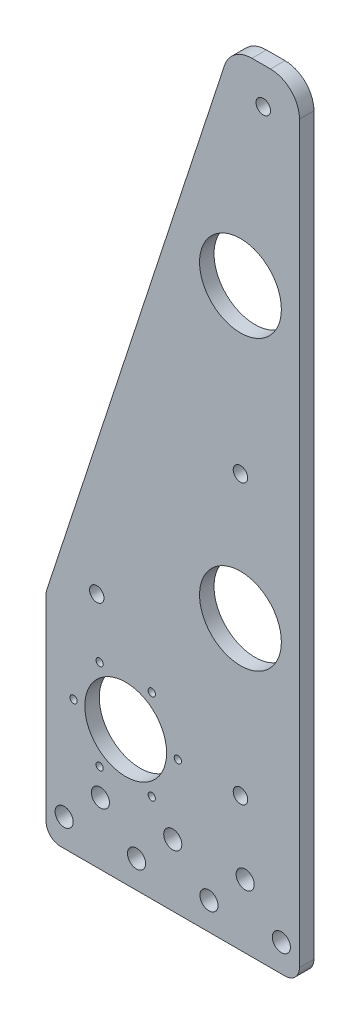
ISO-10303-21;
HEADER;
FILE_DESCRIPTION(('STEP AP214'),'2;1');
FILE_NAME('part.step','',(''),(''),'','','');
FILE_SCHEMA(('AUTOMOTIVE_DESIGN { 1 0 10303 214 1 1 1 1 }'));
ENDSEC;
DATA;
#1=APPLICATION_CONTEXT('core data for automotive mechanical design processes');
#2=APPLICATION_PROTOCOL_DEFINITION('international standard','automotive_design',2000,#1);
#3=PRODUCT_CONTEXT('',#1,'mechanical');
#4=PRODUCT('Part','Part','',(#3));
#5=PRODUCT_RELATED_PRODUCT_CATEGORY('part','',(#4));
#6=PRODUCT_DEFINITION_FORMATION('','',#4);
#7=PRODUCT_DEFINITION_CONTEXT('part definition',#1,'design');
#8=PRODUCT_DEFINITION('design','',#6,#7);
#9=PRODUCT_DEFINITION_SHAPE('','',#8);
#10=(LENGTH_UNIT() NAMED_UNIT(*) SI_UNIT(.MILLI.,.METRE.));
#11=(NAMED_UNIT(*) PLANE_ANGLE_UNIT() SI_UNIT($,.RADIAN.));
#12=(NAMED_UNIT(*) SI_UNIT($,.STERADIAN.) SOLID_ANGLE_UNIT());
#13=UNCERTAINTY_MEASURE_WITH_UNIT(LENGTH_MEASURE(1.E-05),#10,'distance_accuracy_value','');
#14=(GEOMETRIC_REPRESENTATION_CONTEXT(3) GLOBAL_UNCERTAINTY_ASSIGNED_CONTEXT((#13)) GLOBAL_UNIT_ASSIGNED_CONTEXT((#10,
#11,#12)) REPRESENTATION_CONTEXT('',''));
#15=CARTESIAN_POINT('',(0.,0.,0.));
#16=DIRECTION('',(0.,0.,1.));
#17=DIRECTION('',(1.,0.,0.));
#18=AXIS2_PLACEMENT_3D('',#15,#16,#17);
#19=CARTESIAN_POINT('',(55.6253139352506,212.09,5.08));
#20=DIRECTION('',(0.,0.,1.));
#21=DIRECTION('',(1.,0.,0.));
#22=AXIS2_PLACEMENT_3D('',#19,#20,#21);
#23=PLANE('',#22);
#24=CARTESIAN_POINT('',(17.7799999999999,83.058,5.08));
#25=DIRECTION('',(0.,0.,1.));
#26=DIRECTION('',(1.,0.,0.));
#27=AXIS2_PLACEMENT_3D('',#24,#25,#26);
#28=CIRCLE('',#27,2.53999999999999);
#29=CARTESIAN_POINT('',(20.3199999999999,83.058,5.08));
#30=VERTEX_POINT('',#29);
#31=EDGE_CURVE('E394',#30,#30,#28,.T.);
#32=ORIENTED_EDGE('',*,*,#31,.F.);
#33=EDGE_LOOP('',(#32));
#34=FACE_BOUND('',#33,.T.);
#35=DIRECTION('',(0.,1.,0.));
#36=VECTOR('',#35,1.);
#37=CARTESIAN_POINT('',(88.8999999999999,212.09,5.08));
#38=LINE('',#37,#36);
#39=CARTESIAN_POINT('',(88.9000000000002,5.08000000000001,5.08));
#40=VERTEX_POINT('',#39);
#41=CARTESIAN_POINT('',(88.9000000000002,262.89,5.08));
#42=VERTEX_POINT('',#41);
#43=EDGE_CURVE('E132',#40,#42,#38,.T.);
#44=ORIENTED_EDGE('',*,*,#43,.T.);
#45=CARTESIAN_POINT('',(78.7400000000002,262.89,5.08));
#46=DIRECTION('',(0.,0.,1.));
#47=DIRECTION('',(-1.,0.,0.));
#48=AXIS2_PLACEMENT_3D('',#45,#46,#47);
#49=CIRCLE('',#48,10.16);
#50=CARTESIAN_POINT('',(78.7400000000002,273.05,5.08));
#51=VERTEX_POINT('',#50);
#52=EDGE_CURVE('E197',#42,#51,#49,.T.);
#53=ORIENTED_EDGE('',*,*,#52,.T.);
#54=DIRECTION('',(-1.,0.,0.));
#55=VECTOR('',#54,1.);
#56=CARTESIAN_POINT('',(72.2497752500611,273.05,5.08));
#57=LINE('',#56,#55);
#58=CARTESIAN_POINT('',(72.2497752500611,273.05,5.08));
#59=VERTEX_POINT('',#58);
#60=EDGE_CURVE('E375',#51,#59,#57,.T.);
#61=ORIENTED_EDGE('',*,*,#60,.T.);
#62=CARTESIAN_POINT('',(72.2497752500611,262.89,5.08));
#63=DIRECTION('',(0.,0.,1.));
#64=DIRECTION('',(-1.,0.,0.));
#65=AXIS2_PLACEMENT_3D('',#62,#63,#64);
#66=CIRCLE('',#65,10.16);
#67=CARTESIAN_POINT('',(62.5936846110183,266.049986324431,5.08));
#68=VERTEX_POINT('',#67);
#69=EDGE_CURVE('E372',#59,#68,#66,.T.);
#70=ORIENTED_EDGE('',*,*,#69,.T.);
#71=DIRECTION('',(-0.311022276026631,-0.95040262195304,0.));
#72=VECTOR('',#71,1.);
#73=CARTESIAN_POINT('',(45.9692232962077,215.249986324431,5.08));
#74=LINE('',#73,#72);
#75=CARTESIAN_POINT('',(0.251954680478576,75.5499863244306,5.08));
#76=VERTEX_POINT('',#75);
#77=EDGE_CURVE('E97',#68,#76,#74,.T.);
#78=ORIENTED_EDGE('',*,*,#77,.T.);
#79=CARTESIAN_POINT('',(5.08,73.9699931622152,5.08));
#80=DIRECTION('',(0.,0.,1.));
#81=DIRECTION('',(1.,0.,0.));
#82=AXIS2_PLACEMENT_3D('',#79,#80,#81);
#83=CIRCLE('',#82,5.08);
#84=CARTESIAN_POINT('',(0.,73.9699931622152,5.08));
#85=VERTEX_POINT('',#84);
#86=EDGE_CURVE('E357',#76,#85,#83,.T.);
#87=ORIENTED_EDGE('',*,*,#86,.T.);
#88=DIRECTION('',(0.,-1.,0.));
#89=VECTOR('',#88,1.);
#90=CARTESIAN_POINT('',(0.,73.9699931622152,5.08));
#91=LINE('',#90,#89);
#92=CARTESIAN_POINT('',(0.,5.07999999999999,5.08));
#93=VERTEX_POINT('',#92);
#94=EDGE_CURVE('E114',#85,#93,#91,.T.);
#95=ORIENTED_EDGE('',*,*,#94,.T.);
#96=CARTESIAN_POINT('',(5.08000000000002,5.07999999999999,5.08));
#97=DIRECTION('',(0.,0.,1.));
#98=DIRECTION('',(1.,0.,0.));
#99=AXIS2_PLACEMENT_3D('',#96,#97,#98);
#100=CIRCLE('',#99,5.08);
#101=CARTESIAN_POINT('',(5.08000000000002,0.,5.08));
#102=VERTEX_POINT('',#101);
#103=EDGE_CURVE('E108',#93,#102,#100,.T.);
#104=ORIENTED_EDGE('',*,*,#103,.T.);
#105=DIRECTION('',(1.,0.,0.));
#106=VECTOR('',#105,1.);
#107=CARTESIAN_POINT('',(83.82,0.,5.08));
#108=LINE('',#107,#106);
#109=CARTESIAN_POINT('',(83.82,-1.04083408558608E-13,5.08));
#110=VERTEX_POINT('',#109);
#111=EDGE_CURVE('E112',#102,#110,#108,.T.);
#112=ORIENTED_EDGE('',*,*,#111,.T.);
#113=CARTESIAN_POINT('',(83.82,5.08,5.08));
#114=DIRECTION('',(0.,0.,1.));
#115=DIRECTION('',(-1.,0.,0.));
#116=AXIS2_PLACEMENT_3D('',#113,#114,#115);
#117=CIRCLE('',#116,5.0800000000001);
#118=EDGE_CURVE('E59',#110,#40,#117,.T.);
#119=ORIENTED_EDGE('',*,*,#118,.T.);
#120=EDGE_LOOP('',(#44,#53,#61,#70,#78,#87,#95,#104,#112,#119));
#121=FACE_BOUND('',#120,.T.);
#122=CARTESIAN_POINT('',(18.7960000000001,62.8278725844102,5.08));
#123=DIRECTION('',(0.,0.,1.));
#124=DIRECTION('',(1.,0.,0.));
#125=AXIS2_PLACEMENT_3D('',#122,#123,#124);
#126=CIRCLE('',#125,1.27000000000001);
#127=CARTESIAN_POINT('',(20.0660000000001,62.8278725844102,5.08));
#128=VERTEX_POINT('',#127);
#129=EDGE_CURVE('E221',#128,#128,#126,.T.);
#130=ORIENTED_EDGE('',*,*,#129,.F.);
#131=EDGE_LOOP('',(#130));
#132=FACE_BOUND('',#131,.T.);
#133=CARTESIAN_POINT('',(44.45,21.844,5.08));
#134=DIRECTION('',(0.,0.,1.));
#135=DIRECTION('',(-1.,0.,0.));
#136=AXIS2_PLACEMENT_3D('',#133,#134,#135);
#137=CIRCLE('',#136,3.175);
#138=CARTESIAN_POINT('',(41.275,21.844,5.08));
#139=VERTEX_POINT('',#138);
#140=EDGE_CURVE('E237',#139,#139,#137,.T.);
#141=ORIENTED_EDGE('',*,*,#140,.F.);
#142=EDGE_LOOP('',(#141));
#143=FACE_BOUND('',#142,.T.);
#144=CARTESIAN_POINT('',(9.65199999999989,46.9900000000005,5.08));
#145=DIRECTION('',(0.,0.,1.));
#146=DIRECTION('',(1.,0.,0.));
#147=AXIS2_PLACEMENT_3D('',#144,#145,#146);
#148=CIRCLE('',#147,1.27);
#149=CARTESIAN_POINT('',(10.9219999999999,46.9900000000005,5.08));
#150=VERTEX_POINT('',#149);
#151=EDGE_CURVE('E253',#150,#150,#148,.T.);
#152=ORIENTED_EDGE('',*,*,#151,.F.);
#153=EDGE_LOOP('',(#152));
#154=FACE_BOUND('',#153,.T.);
#155=CARTESIAN_POINT('',(82.55,9.652,5.08));
#156=DIRECTION('',(0.,0.,1.));
#157=DIRECTION('',(1.,0.,0.));
#158=AXIS2_PLACEMENT_3D('',#155,#156,#157);
#159=CIRCLE('',#158,3.175);
#160=CARTESIAN_POINT('',(85.725,9.652,5.08));
#161=VERTEX_POINT('',#160);
#162=EDGE_CURVE('E269',#161,#161,#159,.T.);
#163=ORIENTED_EDGE('',*,*,#162,.F.);
#164=EDGE_LOOP('',(#163));
#165=FACE_BOUND('',#164,.T.);
#166=CARTESIAN_POINT('',(31.75,9.652,5.08));
#167=DIRECTION('',(0.,0.,1.));
#168=DIRECTION('',(1.,0.,0.));
#169=AXIS2_PLACEMENT_3D('',#166,#167,#168);
#170=CIRCLE('',#169,3.175);
#171=CARTESIAN_POINT('',(34.925,9.652,5.08));
#172=VERTEX_POINT('',#171);
#173=EDGE_CURVE('E285',#172,#172,#170,.T.);
#174=ORIENTED_EDGE('',*,*,#173,.F.);
#175=EDGE_LOOP('',(#174));
#176=FACE_BOUND('',#175,.T.);
#177=CARTESIAN_POINT('',(6.34999999999999,9.652,5.08));
#178=DIRECTION('',(0.,0.,1.));
#179=DIRECTION('',(1.,0.,0.));
#180=AXIS2_PLACEMENT_3D('',#177,#178,#179);
#181=CIRCLE('',#180,3.175);
#182=CARTESIAN_POINT('',(9.525,9.652,5.08));
#183=VERTEX_POINT('',#182);
#184=EDGE_CURVE('E301',#183,#183,#181,.T.);
#185=ORIENTED_EDGE('',*,*,#184,.F.);
#186=EDGE_LOOP('',(#185));
#187=FACE_BOUND('',#186,.T.);
#188=CARTESIAN_POINT('',(27.9399999999999,46.99,5.08));
#189=DIRECTION('',(0.,0.,1.));
#190=DIRECTION('',(1.,0.,0.));
#191=AXIS2_PLACEMENT_3D('',#188,#189,#190);
#192=CIRCLE('',#191,14.351);
#193=CARTESIAN_POINT('',(42.291,46.99,5.08));
#194=VERTEX_POINT('',#193);
#195=EDGE_CURVE('E317',#194,#194,#192,.T.);
#196=ORIENTED_EDGE('',*,*,#195,.F.);
#197=EDGE_LOOP('',(#196));
#198=FACE_BOUND('',#197,.T.);
#199=CARTESIAN_POINT('',(68.199,46.99,5.08));
#200=DIRECTION('',(0.,0.,1.));
#201=DIRECTION('',(1.,0.,0.));
#202=AXIS2_PLACEMENT_3D('',#199,#200,#201);
#203=CIRCLE('',#202,2.54);
#204=CARTESIAN_POINT('',(70.739,46.99,5.08));
#205=VERTEX_POINT('',#204);
#206=EDGE_CURVE('E333',#205,#205,#203,.T.);
#207=ORIENTED_EDGE('',*,*,#206,.F.);
#208=EDGE_LOOP('',(#207));
#209=FACE_BOUND('',#208,.T.);
#210=CARTESIAN_POINT('',(68.199,201.93,5.08));
#211=DIRECTION('',(0.,0.,1.));
#212=DIRECTION('',(1.,0.,0.));
#213=AXIS2_PLACEMENT_3D('',#210,#211,#212);
#214=CIRCLE('',#213,14.351);
#215=CARTESIAN_POINT('',(82.5499999999999,201.93,5.08));
#216=VERTEX_POINT('',#215);
#217=EDGE_CURVE('E143',#216,#216,#214,.T.);
#218=ORIENTED_EDGE('',*,*,#217,.F.);
#219=EDGE_LOOP('',(#218));
#220=FACE_BOUND('',#219,.T.);
#221=CARTESIAN_POINT('',(68.199,100.838,5.08));
#222=DIRECTION('',(0.,0.,1.));
#223=DIRECTION('',(1.,0.,0.));
#224=AXIS2_PLACEMENT_3D('',#221,#222,#223);
#225=CIRCLE('',#224,14.351);
#226=CARTESIAN_POINT('',(82.55,100.838,5.08));
#227=VERTEX_POINT('',#226);
#228=EDGE_CURVE('E341',#227,#227,#225,.T.);
#229=ORIENTED_EDGE('',*,*,#228,.F.);
#230=EDGE_LOOP('',(#229));
#231=FACE_BOUND('',#230,.T.);
#232=CARTESIAN_POINT('',(68.199,144.78,5.08));
#233=DIRECTION('',(0.,0.,1.));
#234=DIRECTION('',(1.,0.,0.));
#235=AXIS2_PLACEMENT_3D('',#232,#233,#234);
#236=CIRCLE('',#235,2.54);
#237=CARTESIAN_POINT('',(70.739,144.78,5.08));
#238=VERTEX_POINT('',#237);
#239=EDGE_CURVE('E325',#238,#238,#236,.T.);
#240=ORIENTED_EDGE('',*,*,#239,.F.);
#241=EDGE_LOOP('',(#240));
#242=FACE_BOUND('',#241,.T.);
#243=CARTESIAN_POINT('',(46.2279999999999,46.99,5.08));
#244=DIRECTION('',(0.,0.,1.));
#245=DIRECTION('',(1.,0.,0.));
#246=AXIS2_PLACEMENT_3D('',#243,#244,#245);
#247=CIRCLE('',#246,1.27);
#248=CARTESIAN_POINT('',(47.4979999999999,46.99,5.08));
#249=VERTEX_POINT('',#248);
#250=EDGE_CURVE('E309',#249,#249,#247,.T.);
#251=ORIENTED_EDGE('',*,*,#250,.F.);
#252=EDGE_LOOP('',(#251));
#253=FACE_BOUND('',#252,.T.);
#254=CARTESIAN_POINT('',(37.0839999999997,31.1521274155903,5.08));
#255=DIRECTION('',(0.,0.,1.));
#256=DIRECTION('',(1.,0.,0.));
#257=AXIS2_PLACEMENT_3D('',#254,#255,#256);
#258=CIRCLE('',#257,1.27000000000014);
#259=CARTESIAN_POINT('',(38.3539999999998,31.1521274155903,5.08));
#260=VERTEX_POINT('',#259);
#261=EDGE_CURVE('E293',#260,#260,#258,.T.);
#262=ORIENTED_EDGE('',*,*,#261,.F.);
#263=EDGE_LOOP('',(#262));
#264=FACE_BOUND('',#263,.T.);
#265=CARTESIAN_POINT('',(57.15,9.652,5.08));
#266=DIRECTION('',(0.,0.,1.));
#267=DIRECTION('',(1.,0.,0.));
#268=AXIS2_PLACEMENT_3D('',#265,#266,#267);
#269=CIRCLE('',#268,3.17500000000001);
#270=CARTESIAN_POINT('',(60.325,9.652,5.08));
#271=VERTEX_POINT('',#270);
#272=EDGE_CURVE('E277',#271,#271,#269,.T.);
#273=ORIENTED_EDGE('',*,*,#272,.F.);
#274=EDGE_LOOP('',(#273));
#275=FACE_BOUND('',#274,.T.);
#276=CARTESIAN_POINT('',(18.7959999999997,31.1521274155905,5.08));
#277=DIRECTION('',(0.,0.,1.));
#278=DIRECTION('',(1.,0.,0.));
#279=AXIS2_PLACEMENT_3D('',#276,#277,#278);
#280=CIRCLE('',#279,1.27);
#281=CARTESIAN_POINT('',(20.0659999999997,31.1521274155905,5.08));
#282=VERTEX_POINT('',#281);
#283=EDGE_CURVE('E261',#282,#282,#280,.T.);
#284=ORIENTED_EDGE('',*,*,#283,.F.);
#285=EDGE_LOOP('',(#284));
#286=FACE_BOUND('',#285,.T.);
#287=CARTESIAN_POINT('',(69.85,22.352,5.08));
#288=DIRECTION('',(0.,0.,1.));
#289=DIRECTION('',(-1.,0.,0.));
#290=AXIS2_PLACEMENT_3D('',#287,#288,#289);
#291=CIRCLE('',#290,3.175);
#292=CARTESIAN_POINT('',(66.675,22.352,5.08));
#293=VERTEX_POINT('',#292);
#294=EDGE_CURVE('E245',#293,#293,#291,.T.);
#295=ORIENTED_EDGE('',*,*,#294,.F.);
#296=EDGE_LOOP('',(#295));
#297=FACE_BOUND('',#296,.T.);
#298=CARTESIAN_POINT('',(19.05,21.844,5.08));
#299=DIRECTION('',(0.,0.,1.));
#300=DIRECTION('',(-1.,0.,0.));
#301=AXIS2_PLACEMENT_3D('',#298,#299,#300);
#302=CIRCLE('',#301,3.175);
#303=CARTESIAN_POINT('',(15.875,21.844,5.08));
#304=VERTEX_POINT('',#303);
#305=EDGE_CURVE('E229',#304,#304,#302,.T.);
#306=ORIENTED_EDGE('',*,*,#305,.F.);
#307=EDGE_LOOP('',(#306));
#308=FACE_BOUND('',#307,.T.);
#309=CARTESIAN_POINT('',(37.0840000000001,62.8278725844099,5.08));
#310=DIRECTION('',(0.,0.,1.));
#311=DIRECTION('',(1.,0.,0.));
#312=AXIS2_PLACEMENT_3D('',#309,#310,#311);
#313=CIRCLE('',#312,1.26999999999977);
#314=CARTESIAN_POINT('',(38.3539999999999,62.8278725844099,5.08));
#315=VERTEX_POINT('',#314);
#316=EDGE_CURVE('E211',#315,#315,#313,.T.);
#317=ORIENTED_EDGE('',*,*,#316,.F.);
#318=EDGE_LOOP('',(#317));
#319=FACE_BOUND('',#318,.T.);
#320=CARTESIAN_POINT('',(76.2000000000002,260.35,5.08));
#321=DIRECTION('',(0.,0.,1.));
#322=DIRECTION('',(1.,0.,0.));
#323=AXIS2_PLACEMENT_3D('',#320,#321,#322);
#324=CIRCLE('',#323,2.54);
#325=CARTESIAN_POINT('',(78.7400000000002,260.35,5.08));
#326=VERTEX_POINT('',#325);
#327=EDGE_CURVE('E386',#326,#326,#324,.T.);
#328=ORIENTED_EDGE('',*,*,#327,.F.);
#329=EDGE_LOOP('',(#328));
#330=FACE_BOUND('',#329,.T.);
#331=ADVANCED_FACE('F41',(#34,#121,#132,#143,#154,#165,#176,#187,#198,#209,#220,#231,#242,#253,
#264,#275,#286,#297,#308,#319,#330),#23,.T.);
#332=CARTESIAN_POINT('',(55.6253139352506,212.09,0.));
#333=DIRECTION('',(0.,0.,1.));
#334=DIRECTION('',(1.,0.,0.));
#335=AXIS2_PLACEMENT_3D('',#332,#333,#334);
#336=PLANE('',#335);
#337=CARTESIAN_POINT('',(17.7799999999999,83.058,0.));
#338=DIRECTION('',(0.,0.,1.));
#339=DIRECTION('',(1.,0.,0.));
#340=AXIS2_PLACEMENT_3D('',#337,#338,#339);
#341=CIRCLE('',#340,2.53999999999999);
#342=CARTESIAN_POINT('',(20.3199999999999,83.058,0.));
#343=VERTEX_POINT('',#342);
#344=EDGE_CURVE('E390',#343,#343,#341,.T.);
#345=ORIENTED_EDGE('',*,*,#344,.T.);
#346=EDGE_LOOP('',(#345));
#347=FACE_BOUND('',#346,.T.);
#348=CARTESIAN_POINT('',(78.7400000000002,262.89,0.));
#349=DIRECTION('',(0.,0.,1.));
#350=DIRECTION('',(-1.,0.,0.));
#351=AXIS2_PLACEMENT_3D('',#348,#349,#350);
#352=CIRCLE('',#351,10.16);
#353=CARTESIAN_POINT('',(88.9000000000002,262.89,0.));
#354=VERTEX_POINT('',#353);
#355=CARTESIAN_POINT('',(78.7400000000002,273.05,0.));
#356=VERTEX_POINT('',#355);
#357=EDGE_CURVE('E182',#354,#356,#352,.T.);
#358=ORIENTED_EDGE('',*,*,#357,.F.);
#359=DIRECTION('',(0.,1.,0.));
#360=VECTOR('',#359,1.);
#361=CARTESIAN_POINT('',(88.8999999999999,212.09,0.));
#362=LINE('',#361,#360);
#363=CARTESIAN_POINT('',(88.9000000000002,5.08000000000001,0.));
#364=VERTEX_POINT('',#363);
#365=EDGE_CURVE('E155',#364,#354,#362,.T.);
#366=ORIENTED_EDGE('',*,*,#365,.F.);
#367=CARTESIAN_POINT('',(83.82,5.08,0.));
#368=DIRECTION('',(0.,0.,1.));
#369=DIRECTION('',(-1.,0.,0.));
#370=AXIS2_PLACEMENT_3D('',#367,#368,#369);
#371=CIRCLE('',#370,5.0800000000001);
#372=CARTESIAN_POINT('',(83.82,-1.04083408558608E-13,0.));
#373=VERTEX_POINT('',#372);
#374=EDGE_CURVE('E89',#373,#364,#371,.T.);
#375=ORIENTED_EDGE('',*,*,#374,.F.);
#376=DIRECTION('',(1.,0.,0.));
#377=VECTOR('',#376,1.);
#378=CARTESIAN_POINT('',(83.82,0.,0.));
#379=LINE('',#378,#377);
#380=CARTESIAN_POINT('',(5.08000000000002,0.,0.));
#381=VERTEX_POINT('',#380);
#382=EDGE_CURVE('E83',#381,#373,#379,.T.);
#383=ORIENTED_EDGE('',*,*,#382,.F.);
#384=CARTESIAN_POINT('',(5.08000000000002,5.07999999999999,0.));
#385=DIRECTION('',(0.,0.,1.));
#386=DIRECTION('',(1.,0.,0.));
#387=AXIS2_PLACEMENT_3D('',#384,#385,#386);
#388=CIRCLE('',#387,5.08);
#389=CARTESIAN_POINT('',(0.,5.07999999999999,0.));
#390=VERTEX_POINT('',#389);
#391=EDGE_CURVE('E123',#390,#381,#388,.T.);
#392=ORIENTED_EDGE('',*,*,#391,.F.);
#393=DIRECTION('',(0.,-1.,0.));
#394=VECTOR('',#393,1.);
#395=CARTESIAN_POINT('',(0.,73.9699931622152,0.));
#396=LINE('',#395,#394);
#397=CARTESIAN_POINT('',(0.,73.9699931622152,0.));
#398=VERTEX_POINT('',#397);
#399=EDGE_CURVE('E146',#398,#390,#396,.T.);
#400=ORIENTED_EDGE('',*,*,#399,.F.);
#401=CARTESIAN_POINT('',(5.08,73.9699931622152,0.));
#402=DIRECTION('',(0.,0.,1.));
#403=DIRECTION('',(1.,0.,0.));
#404=AXIS2_PLACEMENT_3D('',#401,#402,#403);
#405=CIRCLE('',#404,5.08);
#406=CARTESIAN_POINT('',(0.251954680478576,75.5499863244306,0.));
#407=VERTEX_POINT('',#406);
#408=EDGE_CURVE('E142',#407,#398,#405,.T.);
#409=ORIENTED_EDGE('',*,*,#408,.F.);
#410=DIRECTION('',(-0.311022276026631,-0.95040262195304,0.));
#411=VECTOR('',#410,1.);
#412=CARTESIAN_POINT('',(45.9692232962077,215.249986324431,0.));
#413=LINE('',#412,#411);
#414=CARTESIAN_POINT('',(62.5936846110183,266.049986324431,0.));
#415=VERTEX_POINT('',#414);
#416=EDGE_CURVE('E139',#415,#407,#413,.T.);
#417=ORIENTED_EDGE('',*,*,#416,.F.);
#418=CARTESIAN_POINT('',(72.2497752500611,262.89,0.));
#419=DIRECTION('',(0.,0.,1.));
#420=DIRECTION('',(-1.,0.,0.));
#421=AXIS2_PLACEMENT_3D('',#418,#419,#420);
#422=CIRCLE('',#421,10.16);
#423=CARTESIAN_POINT('',(72.2497752500611,273.05,0.));
#424=VERTEX_POINT('',#423);
#425=EDGE_CURVE('E200',#424,#415,#422,.T.);
#426=ORIENTED_EDGE('',*,*,#425,.F.);
#427=DIRECTION('',(-1.,0.,0.));
#428=VECTOR('',#427,1.);
#429=CARTESIAN_POINT('',(72.2497752500611,273.05,0.));
#430=LINE('',#429,#428);
#431=EDGE_CURVE('E207',#356,#424,#430,.T.);
#432=ORIENTED_EDGE('',*,*,#431,.F.);
#433=EDGE_LOOP('',(#358,#366,#375,#383,#392,#400,#409,#417,#426,#432));
#434=FACE_BOUND('',#433,.T.);
#435=CARTESIAN_POINT('',(68.199,201.93,0.));
#436=DIRECTION('',(0.,0.,1.));
#437=DIRECTION('',(1.,0.,0.));
#438=AXIS2_PLACEMENT_3D('',#435,#436,#437);
#439=CIRCLE('',#438,14.351);
#440=CARTESIAN_POINT('',(82.5499999999999,201.93,0.));
#441=VERTEX_POINT('',#440);
#442=EDGE_CURVE('E345',#441,#441,#439,.T.);
#443=ORIENTED_EDGE('',*,*,#442,.T.);
#444=EDGE_LOOP('',(#443));
#445=FACE_BOUND('',#444,.T.);
#446=CARTESIAN_POINT('',(68.199,100.838,0.));
#447=DIRECTION('',(0.,0.,1.));
#448=DIRECTION('',(1.,0.,0.));
#449=AXIS2_PLACEMENT_3D('',#446,#447,#448);
#450=CIRCLE('',#449,14.351);
#451=CARTESIAN_POINT('',(82.55,100.838,0.));
#452=VERTEX_POINT('',#451);
#453=EDGE_CURVE('E337',#452,#452,#450,.T.);
#454=ORIENTED_EDGE('',*,*,#453,.T.);
#455=EDGE_LOOP('',(#454));
#456=FACE_BOUND('',#455,.T.);
#457=CARTESIAN_POINT('',(68.199,46.99,0.));
#458=DIRECTION('',(0.,0.,1.));
#459=DIRECTION('',(1.,0.,0.));
#460=AXIS2_PLACEMENT_3D('',#457,#458,#459);
#461=CIRCLE('',#460,2.54);
#462=CARTESIAN_POINT('',(70.739,46.99,0.));
#463=VERTEX_POINT('',#462);
#464=EDGE_CURVE('E329',#463,#463,#461,.T.);
#465=ORIENTED_EDGE('',*,*,#464,.T.);
#466=EDGE_LOOP('',(#465));
#467=FACE_BOUND('',#466,.T.);
#468=CARTESIAN_POINT('',(68.199,144.78,0.));
#469=DIRECTION('',(0.,0.,1.));
#470=DIRECTION('',(1.,0.,0.));
#471=AXIS2_PLACEMENT_3D('',#468,#469,#470);
#472=CIRCLE('',#471,2.54);
#473=CARTESIAN_POINT('',(70.739,144.78,0.));
#474=VERTEX_POINT('',#473);
#475=EDGE_CURVE('E321',#474,#474,#472,.T.);
#476=ORIENTED_EDGE('',*,*,#475,.T.);
#477=EDGE_LOOP('',(#476));
#478=FACE_BOUND('',#477,.T.);
#479=CARTESIAN_POINT('',(27.9399999999999,46.99,0.));
#480=DIRECTION('',(0.,0.,1.));
#481=DIRECTION('',(1.,0.,0.));
#482=AXIS2_PLACEMENT_3D('',#479,#480,#481);
#483=CIRCLE('',#482,14.351);
#484=CARTESIAN_POINT('',(42.291,46.99,0.));
#485=VERTEX_POINT('',#484);
#486=EDGE_CURVE('E313',#485,#485,#483,.T.);
#487=ORIENTED_EDGE('',*,*,#486,.T.);
#488=EDGE_LOOP('',(#487));
#489=FACE_BOUND('',#488,.T.);
#490=CARTESIAN_POINT('',(46.2279999999999,46.99,0.));
#491=DIRECTION('',(0.,0.,1.));
#492=DIRECTION('',(1.,0.,0.));
#493=AXIS2_PLACEMENT_3D('',#490,#491,#492);
#494=CIRCLE('',#493,1.27);
#495=CARTESIAN_POINT('',(47.4979999999999,46.99,0.));
#496=VERTEX_POINT('',#495);
#497=EDGE_CURVE('E305',#496,#496,#494,.T.);
#498=ORIENTED_EDGE('',*,*,#497,.T.);
#499=EDGE_LOOP('',(#498));
#500=FACE_BOUND('',#499,.T.);
#501=CARTESIAN_POINT('',(6.34999999999999,9.652,0.));
#502=DIRECTION('',(0.,0.,1.));
#503=DIRECTION('',(1.,0.,0.));
#504=AXIS2_PLACEMENT_3D('',#501,#502,#503);
#505=CIRCLE('',#504,3.175);
#506=CARTESIAN_POINT('',(9.525,9.652,0.));
#507=VERTEX_POINT('',#506);
#508=EDGE_CURVE('E297',#507,#507,#505,.T.);
#509=ORIENTED_EDGE('',*,*,#508,.T.);
#510=EDGE_LOOP('',(#509));
#511=FACE_BOUND('',#510,.T.);
#512=CARTESIAN_POINT('',(37.0839999999997,31.1521274155903,0.));
#513=DIRECTION('',(0.,0.,1.));
#514=DIRECTION('',(1.,0.,0.));
#515=AXIS2_PLACEMENT_3D('',#512,#513,#514);
#516=CIRCLE('',#515,1.27000000000014);
#517=CARTESIAN_POINT('',(38.3539999999998,31.1521274155903,0.));
#518=VERTEX_POINT('',#517);
#519=EDGE_CURVE('E289',#518,#518,#516,.T.);
#520=ORIENTED_EDGE('',*,*,#519,.T.);
#521=EDGE_LOOP('',(#520));
#522=FACE_BOUND('',#521,.T.);
#523=CARTESIAN_POINT('',(31.75,9.652,0.));
#524=DIRECTION('',(0.,0.,1.));
#525=DIRECTION('',(1.,0.,0.));
#526=AXIS2_PLACEMENT_3D('',#523,#524,#525);
#527=CIRCLE('',#526,3.175);
#528=CARTESIAN_POINT('',(34.925,9.652,0.));
#529=VERTEX_POINT('',#528);
#530=EDGE_CURVE('E281',#529,#529,#527,.T.);
#531=ORIENTED_EDGE('',*,*,#530,.T.);
#532=EDGE_LOOP('',(#531));
#533=FACE_BOUND('',#532,.T.);
#534=CARTESIAN_POINT('',(57.15,9.652,0.));
#535=DIRECTION('',(0.,0.,1.));
#536=DIRECTION('',(1.,0.,0.));
#537=AXIS2_PLACEMENT_3D('',#534,#535,#536);
#538=CIRCLE('',#537,3.17500000000001);
#539=CARTESIAN_POINT('',(60.325,9.652,0.));
#540=VERTEX_POINT('',#539);
#541=EDGE_CURVE('E273',#540,#540,#538,.T.);
#542=ORIENTED_EDGE('',*,*,#541,.T.);
#543=EDGE_LOOP('',(#542));
#544=FACE_BOUND('',#543,.T.);
#545=CARTESIAN_POINT('',(82.55,9.652,0.));
#546=DIRECTION('',(0.,0.,1.));
#547=DIRECTION('',(1.,0.,0.));
#548=AXIS2_PLACEMENT_3D('',#545,#546,#547);
#549=CIRCLE('',#548,3.175);
#550=CARTESIAN_POINT('',(85.725,9.652,0.));
#551=VERTEX_POINT('',#550);
#552=EDGE_CURVE('E265',#551,#551,#549,.T.);
#553=ORIENTED_EDGE('',*,*,#552,.T.);
#554=EDGE_LOOP('',(#553));
#555=FACE_BOUND('',#554,.T.);
#556=CARTESIAN_POINT('',(18.7959999999997,31.1521274155905,0.));
#557=DIRECTION('',(0.,0.,1.));
#558=DIRECTION('',(1.,0.,0.));
#559=AXIS2_PLACEMENT_3D('',#556,#557,#558);
#560=CIRCLE('',#559,1.27);
#561=CARTESIAN_POINT('',(20.0659999999997,31.1521274155905,0.));
#562=VERTEX_POINT('',#561);
#563=EDGE_CURVE('E257',#562,#562,#560,.T.);
#564=ORIENTED_EDGE('',*,*,#563,.T.);
#565=EDGE_LOOP('',(#564));
#566=FACE_BOUND('',#565,.T.);
#567=CARTESIAN_POINT('',(9.65199999999989,46.9900000000005,0.));
#568=DIRECTION('',(0.,0.,1.));
#569=DIRECTION('',(1.,0.,0.));
#570=AXIS2_PLACEMENT_3D('',#567,#568,#569);
#571=CIRCLE('',#570,1.27);
#572=CARTESIAN_POINT('',(10.9219999999999,46.9900000000005,0.));
#573=VERTEX_POINT('',#572);
#574=EDGE_CURVE('E249',#573,#573,#571,.T.);
#575=ORIENTED_EDGE('',*,*,#574,.T.);
#576=EDGE_LOOP('',(#575));
#577=FACE_BOUND('',#576,.T.);
#578=CARTESIAN_POINT('',(69.85,22.352,0.));
#579=DIRECTION('',(0.,0.,1.));
#580=DIRECTION('',(-1.,0.,0.));
#581=AXIS2_PLACEMENT_3D('',#578,#579,#580);
#582=CIRCLE('',#581,3.175);
#583=CARTESIAN_POINT('',(66.675,22.352,0.));
#584=VERTEX_POINT('',#583);
#585=EDGE_CURVE('E241',#584,#584,#582,.T.);
#586=ORIENTED_EDGE('',*,*,#585,.T.);
#587=EDGE_LOOP('',(#586));
#588=FACE_BOUND('',#587,.T.);
#589=CARTESIAN_POINT('',(44.45,21.844,0.));
#590=DIRECTION('',(0.,0.,1.));
#591=DIRECTION('',(-1.,0.,0.));
#592=AXIS2_PLACEMENT_3D('',#589,#590,#591);
#593=CIRCLE('',#592,3.175);
#594=CARTESIAN_POINT('',(41.275,21.844,0.));
#595=VERTEX_POINT('',#594);
#596=EDGE_CURVE('E233',#595,#595,#593,.T.);
#597=ORIENTED_EDGE('',*,*,#596,.T.);
#598=EDGE_LOOP('',(#597));
#599=FACE_BOUND('',#598,.T.);
#600=CARTESIAN_POINT('',(19.05,21.844,0.));
#601=DIRECTION('',(0.,0.,1.));
#602=DIRECTION('',(-1.,0.,0.));
#603=AXIS2_PLACEMENT_3D('',#600,#601,#602);
#604=CIRCLE('',#603,3.175);
#605=CARTESIAN_POINT('',(15.875,21.844,0.));
#606=VERTEX_POINT('',#605);
#607=EDGE_CURVE('E225',#606,#606,#604,.T.);
#608=ORIENTED_EDGE('',*,*,#607,.T.);
#609=EDGE_LOOP('',(#608));
#610=FACE_BOUND('',#609,.T.);
#611=CARTESIAN_POINT('',(18.7960000000001,62.8278725844102,0.));
#612=DIRECTION('',(0.,0.,1.));
#613=DIRECTION('',(1.,0.,0.));
#614=AXIS2_PLACEMENT_3D('',#611,#612,#613);
#615=CIRCLE('',#614,1.27000000000001);
#616=CARTESIAN_POINT('',(20.0660000000001,62.8278725844102,0.));
#617=VERTEX_POINT('',#616);
#618=EDGE_CURVE('E215',#617,#617,#615,.T.);
#619=ORIENTED_EDGE('',*,*,#618,.T.);
#620=EDGE_LOOP('',(#619));
#621=FACE_BOUND('',#620,.T.);
#622=CARTESIAN_POINT('',(37.0840000000001,62.8278725844099,0.));
#623=DIRECTION('',(0.,0.,1.));
#624=DIRECTION('',(1.,0.,0.));
#625=AXIS2_PLACEMENT_3D('',#622,#623,#624);
#626=CIRCLE('',#625,1.26999999999977);
#627=CARTESIAN_POINT('',(38.3539999999999,62.8278725844099,0.));
#628=VERTEX_POINT('',#627);
#629=EDGE_CURVE('E216',#628,#628,#626,.T.);
#630=ORIENTED_EDGE('',*,*,#629,.T.);
#631=EDGE_LOOP('',(#630));
#632=FACE_BOUND('',#631,.T.);
#633=CARTESIAN_POINT('',(76.2000000000002,260.35,0.));
#634=DIRECTION('',(0.,0.,1.));
#635=DIRECTION('',(1.,0.,0.));
#636=AXIS2_PLACEMENT_3D('',#633,#634,#635);
#637=CIRCLE('',#636,2.54);
#638=CARTESIAN_POINT('',(78.7400000000002,260.35,0.));
#639=VERTEX_POINT('',#638);
#640=EDGE_CURVE('E380',#639,#639,#637,.T.);
#641=ORIENTED_EDGE('',*,*,#640,.T.);
#642=EDGE_LOOP('',(#641));
#643=FACE_BOUND('',#642,.T.);
#644=ADVANCED_FACE('F175',(#347,#434,#445,#456,#467,#478,#489,#500,#511,#522,#533,#544,#555,
#566,#577,#588,#599,#610,#621,#632,#643),#336,.F.);
#645=CARTESIAN_POINT('',(45.9692232962077,215.249986324431,5.08));
#646=DIRECTION('',(0.95040262195304,-0.311022276026631,0.));
#647=DIRECTION('',(0.311022276026631,0.95040262195304,0.));
#648=AXIS2_PLACEMENT_3D('',#645,#646,#647);
#649=PLANE('',#648);
#650=ORIENTED_EDGE('',*,*,#416,.T.);
#651=DIRECTION('',(0.,0.,-1.));
#652=VECTOR('',#651,1.);
#653=CARTESIAN_POINT('',(0.251954680478576,75.5499863244306,5.08));
#654=LINE('',#653,#652);
#655=EDGE_CURVE('E11',#76,#407,#654,.T.);
#656=ORIENTED_EDGE('',*,*,#655,.F.);
#657=ORIENTED_EDGE('',*,*,#77,.F.);
#658=DIRECTION('',(0.,0.,1.));
#659=VECTOR('',#658,1.);
#660=CARTESIAN_POINT('',(62.5936846110183,266.049986324431,0.));
#661=LINE('',#660,#659);
#662=EDGE_CURVE('E220',#415,#68,#661,.T.);
#663=ORIENTED_EDGE('',*,*,#662,.F.);
#664=EDGE_LOOP('',(#650,#656,#657,#663));
#665=FACE_BOUND('',#664,.T.);
#666=ADVANCED_FACE('F43',(#665),#649,.F.);
#667=CARTESIAN_POINT('',(5.08,73.9699931622152,5.08));
#668=DIRECTION('',(0.,0.,-1.));
#669=DIRECTION('',(-1.,0.,0.));
#670=AXIS2_PLACEMENT_3D('',#667,#668,#669);
#671=CYLINDRICAL_SURFACE('',#670,5.08);
#672=ORIENTED_EDGE('',*,*,#408,.T.);
#673=DIRECTION('',(0.,0.,-1.));
#674=VECTOR('',#673,1.);
#675=CARTESIAN_POINT('',(0.,73.9699931622152,5.08));
#676=LINE('',#675,#674);
#677=EDGE_CURVE('E51',#85,#398,#676,.T.);
#678=ORIENTED_EDGE('',*,*,#677,.F.);
#679=ORIENTED_EDGE('',*,*,#86,.F.);
#680=ORIENTED_EDGE('',*,*,#655,.T.);
#681=EDGE_LOOP('',(#672,#678,#679,#680));
#682=FACE_BOUND('',#681,.T.);
#683=ADVANCED_FACE('F430',(#682),#671,.T.);
#684=CARTESIAN_POINT('',(0.,73.9699931622152,5.08));
#685=DIRECTION('',(1.,0.,0.));
#686=DIRECTION('',(0.,1.,0.));
#687=AXIS2_PLACEMENT_3D('',#684,#685,#686);
#688=PLANE('',#687);
#689=ORIENTED_EDGE('',*,*,#399,.T.);
#690=DIRECTION('',(0.,0.,-1.));
#691=VECTOR('',#690,1.);
#692=CARTESIAN_POINT('',(0.,5.07999999999999,5.08));
#693=LINE('',#692,#691);
#694=EDGE_CURVE('E125',#93,#390,#693,.T.);
#695=ORIENTED_EDGE('',*,*,#694,.F.);
#696=ORIENTED_EDGE('',*,*,#94,.F.);
#697=ORIENTED_EDGE('',*,*,#677,.T.);
#698=EDGE_LOOP('',(#689,#695,#696,#697));
#699=FACE_BOUND('',#698,.T.);
#700=ADVANCED_FACE('F169',(#699),#688,.F.);
#701=CARTESIAN_POINT('',(5.08000000000002,5.07999999999999,5.08));
#702=DIRECTION('',(0.,0.,-1.));
#703=DIRECTION('',(-1.,0.,0.));
#704=AXIS2_PLACEMENT_3D('',#701,#702,#703);
#705=CYLINDRICAL_SURFACE('',#704,5.08);
#706=ORIENTED_EDGE('',*,*,#391,.T.);
#707=DIRECTION('',(0.,0.,-1.));
#708=VECTOR('',#707,1.);
#709=CARTESIAN_POINT('',(5.08000000000002,0.,5.08));
#710=LINE('',#709,#708);
#711=EDGE_CURVE('E120',#102,#381,#710,.T.);
#712=ORIENTED_EDGE('',*,*,#711,.F.);
#713=ORIENTED_EDGE('',*,*,#103,.F.);
#714=ORIENTED_EDGE('',*,*,#694,.T.);
#715=EDGE_LOOP('',(#706,#712,#713,#714));
#716=FACE_BOUND('',#715,.T.);
#717=ADVANCED_FACE('F121',(#716),#705,.T.);
#718=CARTESIAN_POINT('',(83.82,0.,5.08));
#719=DIRECTION('',(0.,1.,0.));
#720=DIRECTION('',(-1.,0.,0.));
#721=AXIS2_PLACEMENT_3D('',#718,#719,#720);
#722=PLANE('',#721);
#723=ORIENTED_EDGE('',*,*,#382,.T.);
#724=DIRECTION('',(0.,0.,-1.));
#725=VECTOR('',#724,1.);
#726=CARTESIAN_POINT('',(83.82,-1.04083408558608E-13,5.08));
#727=LINE('',#726,#725);
#728=EDGE_CURVE('E126',#110,#373,#727,.T.);
#729=ORIENTED_EDGE('',*,*,#728,.F.);
#730=ORIENTED_EDGE('',*,*,#111,.F.);
#731=ORIENTED_EDGE('',*,*,#711,.T.);
#732=EDGE_LOOP('',(#723,#729,#730,#731));
#733=FACE_BOUND('',#732,.T.);
#734=ADVANCED_FACE('F128',(#733),#722,.F.);
#735=CARTESIAN_POINT('',(83.82,5.08,5.08));
#736=DIRECTION('',(0.,0.,-1.));
#737=DIRECTION('',(-1.,0.,0.));
#738=AXIS2_PLACEMENT_3D('',#735,#736,#737);
#739=CYLINDRICAL_SURFACE('',#738,5.0800000000001);
#740=ORIENTED_EDGE('',*,*,#374,.T.);
#741=DIRECTION('',(0.,0.,-1.));
#742=VECTOR('',#741,1.);
#743=CARTESIAN_POINT('',(88.9000000000002,5.08000000000001,5.08));
#744=LINE('',#743,#742);
#745=EDGE_CURVE('E138',#40,#364,#744,.T.);
#746=ORIENTED_EDGE('',*,*,#745,.F.);
#747=ORIENTED_EDGE('',*,*,#118,.F.);
#748=ORIENTED_EDGE('',*,*,#728,.T.);
#749=EDGE_LOOP('',(#740,#746,#747,#748));
#750=FACE_BOUND('',#749,.T.);
#751=ADVANCED_FACE('F422',(#750),#739,.T.);
#752=CARTESIAN_POINT('',(88.8999999999999,212.09,5.08));
#753=DIRECTION('',(-1.,0.,0.));
#754=DIRECTION('',(0.,-1.,0.));
#755=AXIS2_PLACEMENT_3D('',#752,#753,#754);
#756=PLANE('',#755);
#757=ORIENTED_EDGE('',*,*,#365,.T.);
#758=DIRECTION('',(0.,0.,1.));
#759=VECTOR('',#758,1.);
#760=CARTESIAN_POINT('',(88.9000000000002,262.89,0.));
#761=LINE('',#760,#759);
#762=EDGE_CURVE('E189',#354,#42,#761,.T.);
#763=ORIENTED_EDGE('',*,*,#762,.T.);
#764=ORIENTED_EDGE('',*,*,#43,.F.);
#765=ORIENTED_EDGE('',*,*,#745,.T.);
#766=EDGE_LOOP('',(#757,#763,#764,#765));
#767=FACE_BOUND('',#766,.T.);
#768=ADVANCED_FACE('F186',(#767),#756,.F.);
#769=CARTESIAN_POINT('',(68.199,201.93,5.08));
#770=DIRECTION('',(0.,0.,-1.));
#771=DIRECTION('',(-1.,0.,0.));
#772=AXIS2_PLACEMENT_3D('',#769,#770,#771);
#773=CYLINDRICAL_SURFACE('',#772,14.351);
#774=ORIENTED_EDGE('',*,*,#217,.T.);
#775=EDGE_LOOP('',(#774));
#776=FACE_BOUND('',#775,.T.);
#777=ORIENTED_EDGE('',*,*,#442,.F.);
#778=EDGE_LOOP('',(#777));
#779=FACE_BOUND('',#778,.T.);
#780=ADVANCED_FACE('F417',(#776,#779),#773,.F.);
#781=CARTESIAN_POINT('',(68.199,100.838,5.08));
#782=DIRECTION('',(0.,0.,-1.));
#783=DIRECTION('',(-1.,0.,0.));
#784=AXIS2_PLACEMENT_3D('',#781,#782,#783);
#785=CYLINDRICAL_SURFACE('',#784,14.351);
#786=ORIENTED_EDGE('',*,*,#228,.T.);
#787=EDGE_LOOP('',(#786));
#788=FACE_BOUND('',#787,.T.);
#789=ORIENTED_EDGE('',*,*,#453,.F.);
#790=EDGE_LOOP('',(#789));
#791=FACE_BOUND('',#790,.T.);
#792=ADVANCED_FACE('F521',(#788,#791),#785,.F.);
#793=CARTESIAN_POINT('',(68.199,46.99,5.08));
#794=DIRECTION('',(0.,0.,-1.));
#795=DIRECTION('',(-1.,0.,0.));
#796=AXIS2_PLACEMENT_3D('',#793,#794,#795);
#797=CYLINDRICAL_SURFACE('',#796,2.54);
#798=ORIENTED_EDGE('',*,*,#206,.T.);
#799=EDGE_LOOP('',(#798));
#800=FACE_BOUND('',#799,.T.);
#801=ORIENTED_EDGE('',*,*,#464,.F.);
#802=EDGE_LOOP('',(#801));
#803=FACE_BOUND('',#802,.T.);
#804=ADVANCED_FACE('F518',(#800,#803),#797,.F.);
#805=CARTESIAN_POINT('',(68.199,144.78,5.08));
#806=DIRECTION('',(0.,0.,-1.));
#807=DIRECTION('',(-1.,0.,0.));
#808=AXIS2_PLACEMENT_3D('',#805,#806,#807);
#809=CYLINDRICAL_SURFACE('',#808,2.54);
#810=ORIENTED_EDGE('',*,*,#239,.T.);
#811=EDGE_LOOP('',(#810));
#812=FACE_BOUND('',#811,.T.);
#813=ORIENTED_EDGE('',*,*,#475,.F.);
#814=EDGE_LOOP('',(#813));
#815=FACE_BOUND('',#814,.T.);
#816=ADVANCED_FACE('F514',(#812,#815),#809,.F.);
#817=CARTESIAN_POINT('',(27.9399999999999,46.99,5.08));
#818=DIRECTION('',(0.,0.,-1.));
#819=DIRECTION('',(-1.,0.,0.));
#820=AXIS2_PLACEMENT_3D('',#817,#818,#819);
#821=CYLINDRICAL_SURFACE('',#820,14.351);
#822=ORIENTED_EDGE('',*,*,#195,.T.);
#823=EDGE_LOOP('',(#822));
#824=FACE_BOUND('',#823,.T.);
#825=ORIENTED_EDGE('',*,*,#486,.F.);
#826=EDGE_LOOP('',(#825));
#827=FACE_BOUND('',#826,.T.);
#828=ADVANCED_FACE('F510',(#824,#827),#821,.F.);
#829=CARTESIAN_POINT('',(46.2279999999999,46.99,5.08));
#830=DIRECTION('',(0.,0.,-1.));
#831=DIRECTION('',(-1.,0.,0.));
#832=AXIS2_PLACEMENT_3D('',#829,#830,#831);
#833=CYLINDRICAL_SURFACE('',#832,1.27);
#834=ORIENTED_EDGE('',*,*,#250,.T.);
#835=EDGE_LOOP('',(#834));
#836=FACE_BOUND('',#835,.T.);
#837=ORIENTED_EDGE('',*,*,#497,.F.);
#838=EDGE_LOOP('',(#837));
#839=FACE_BOUND('',#838,.T.);
#840=ADVANCED_FACE('F506',(#836,#839),#833,.F.);
#841=CARTESIAN_POINT('',(6.34999999999999,9.652,5.08));
#842=DIRECTION('',(0.,0.,-1.));
#843=DIRECTION('',(-1.,0.,0.));
#844=AXIS2_PLACEMENT_3D('',#841,#842,#843);
#845=CYLINDRICAL_SURFACE('',#844,3.175);
#846=ORIENTED_EDGE('',*,*,#184,.T.);
#847=EDGE_LOOP('',(#846));
#848=FACE_BOUND('',#847,.T.);
#849=ORIENTED_EDGE('',*,*,#508,.F.);
#850=EDGE_LOOP('',(#849));
#851=FACE_BOUND('',#850,.T.);
#852=ADVANCED_FACE('F502',(#848,#851),#845,.F.);
#853=CARTESIAN_POINT('',(37.0839999999997,31.1521274155903,5.08));
#854=DIRECTION('',(0.,0.,-1.));
#855=DIRECTION('',(-1.,0.,0.));
#856=AXIS2_PLACEMENT_3D('',#853,#854,#855);
#857=CYLINDRICAL_SURFACE('',#856,1.27000000000014);
#858=ORIENTED_EDGE('',*,*,#261,.T.);
#859=EDGE_LOOP('',(#858));
#860=FACE_BOUND('',#859,.T.);
#861=ORIENTED_EDGE('',*,*,#519,.F.);
#862=EDGE_LOOP('',(#861));
#863=FACE_BOUND('',#862,.T.);
#864=ADVANCED_FACE('F498',(#860,#863),#857,.F.);
#865=CARTESIAN_POINT('',(31.75,9.652,5.08));
#866=DIRECTION('',(0.,0.,-1.));
#867=DIRECTION('',(-1.,0.,0.));
#868=AXIS2_PLACEMENT_3D('',#865,#866,#867);
#869=CYLINDRICAL_SURFACE('',#868,3.175);
#870=ORIENTED_EDGE('',*,*,#173,.T.);
#871=EDGE_LOOP('',(#870));
#872=FACE_BOUND('',#871,.T.);
#873=ORIENTED_EDGE('',*,*,#530,.F.);
#874=EDGE_LOOP('',(#873));
#875=FACE_BOUND('',#874,.T.);
#876=ADVANCED_FACE('F494',(#872,#875),#869,.F.);
#877=CARTESIAN_POINT('',(57.15,9.652,5.08));
#878=DIRECTION('',(0.,0.,-1.));
#879=DIRECTION('',(-1.,0.,0.));
#880=AXIS2_PLACEMENT_3D('',#877,#878,#879);
#881=CYLINDRICAL_SURFACE('',#880,3.17500000000001);
#882=ORIENTED_EDGE('',*,*,#272,.T.);
#883=EDGE_LOOP('',(#882));
#884=FACE_BOUND('',#883,.T.);
#885=ORIENTED_EDGE('',*,*,#541,.F.);
#886=EDGE_LOOP('',(#885));
#887=FACE_BOUND('',#886,.T.);
#888=ADVANCED_FACE('F490',(#884,#887),#881,.F.);
#889=CARTESIAN_POINT('',(82.55,9.652,5.08));
#890=DIRECTION('',(0.,0.,-1.));
#891=DIRECTION('',(-1.,0.,0.));
#892=AXIS2_PLACEMENT_3D('',#889,#890,#891);
#893=CYLINDRICAL_SURFACE('',#892,3.175);
#894=ORIENTED_EDGE('',*,*,#162,.T.);
#895=EDGE_LOOP('',(#894));
#896=FACE_BOUND('',#895,.T.);
#897=ORIENTED_EDGE('',*,*,#552,.F.);
#898=EDGE_LOOP('',(#897));
#899=FACE_BOUND('',#898,.T.);
#900=ADVANCED_FACE('F486',(#896,#899),#893,.F.);
#901=CARTESIAN_POINT('',(18.7959999999997,31.1521274155905,5.08));
#902=DIRECTION('',(0.,0.,-1.));
#903=DIRECTION('',(-1.,0.,0.));
#904=AXIS2_PLACEMENT_3D('',#901,#902,#903);
#905=CYLINDRICAL_SURFACE('',#904,1.27);
#906=ORIENTED_EDGE('',*,*,#283,.T.);
#907=EDGE_LOOP('',(#906));
#908=FACE_BOUND('',#907,.T.);
#909=ORIENTED_EDGE('',*,*,#563,.F.);
#910=EDGE_LOOP('',(#909));
#911=FACE_BOUND('',#910,.T.);
#912=ADVANCED_FACE('F482',(#908,#911),#905,.F.);
#913=CARTESIAN_POINT('',(9.65199999999989,46.9900000000005,5.08));
#914=DIRECTION('',(0.,0.,-1.));
#915=DIRECTION('',(-1.,0.,0.));
#916=AXIS2_PLACEMENT_3D('',#913,#914,#915);
#917=CYLINDRICAL_SURFACE('',#916,1.27);
#918=ORIENTED_EDGE('',*,*,#151,.T.);
#919=EDGE_LOOP('',(#918));
#920=FACE_BOUND('',#919,.T.);
#921=ORIENTED_EDGE('',*,*,#574,.F.);
#922=EDGE_LOOP('',(#921));
#923=FACE_BOUND('',#922,.T.);
#924=ADVANCED_FACE('F478',(#920,#923),#917,.F.);
#925=CARTESIAN_POINT('',(69.85,22.352,5.08));
#926=DIRECTION('',(0.,0.,-1.));
#927=DIRECTION('',(-1.,0.,0.));
#928=AXIS2_PLACEMENT_3D('',#925,#926,#927);
#929=CYLINDRICAL_SURFACE('',#928,3.175);
#930=ORIENTED_EDGE('',*,*,#294,.T.);
#931=EDGE_LOOP('',(#930));
#932=FACE_BOUND('',#931,.T.);
#933=ORIENTED_EDGE('',*,*,#585,.F.);
#934=EDGE_LOOP('',(#933));
#935=FACE_BOUND('',#934,.T.);
#936=ADVANCED_FACE('F474',(#932,#935),#929,.F.);
#937=CARTESIAN_POINT('',(44.45,21.844,5.08));
#938=DIRECTION('',(0.,0.,-1.));
#939=DIRECTION('',(-1.,0.,0.));
#940=AXIS2_PLACEMENT_3D('',#937,#938,#939);
#941=CYLINDRICAL_SURFACE('',#940,3.175);
#942=ORIENTED_EDGE('',*,*,#140,.T.);
#943=EDGE_LOOP('',(#942));
#944=FACE_BOUND('',#943,.T.);
#945=ORIENTED_EDGE('',*,*,#596,.F.);
#946=EDGE_LOOP('',(#945));
#947=FACE_BOUND('',#946,.T.);
#948=ADVANCED_FACE('F470',(#944,#947),#941,.F.);
#949=CARTESIAN_POINT('',(19.05,21.844,5.08));
#950=DIRECTION('',(0.,0.,-1.));
#951=DIRECTION('',(-1.,0.,0.));
#952=AXIS2_PLACEMENT_3D('',#949,#950,#951);
#953=CYLINDRICAL_SURFACE('',#952,3.175);
#954=ORIENTED_EDGE('',*,*,#305,.T.);
#955=EDGE_LOOP('',(#954));
#956=FACE_BOUND('',#955,.T.);
#957=ORIENTED_EDGE('',*,*,#607,.F.);
#958=EDGE_LOOP('',(#957));
#959=FACE_BOUND('',#958,.T.);
#960=ADVANCED_FACE('F466',(#956,#959),#953,.F.);
#961=CARTESIAN_POINT('',(18.7960000000001,62.8278725844102,5.08));
#962=DIRECTION('',(0.,0.,-1.));
#963=DIRECTION('',(-1.,0.,0.));
#964=AXIS2_PLACEMENT_3D('',#961,#962,#963);
#965=CYLINDRICAL_SURFACE('',#964,1.27000000000001);
#966=ORIENTED_EDGE('',*,*,#129,.T.);
#967=EDGE_LOOP('',(#966));
#968=FACE_BOUND('',#967,.T.);
#969=ORIENTED_EDGE('',*,*,#618,.F.);
#970=EDGE_LOOP('',(#969));
#971=FACE_BOUND('',#970,.T.);
#972=ADVANCED_FACE('F457',(#968,#971),#965,.F.);
#973=CARTESIAN_POINT('',(37.0840000000001,62.8278725844099,5.08));
#974=DIRECTION('',(0.,0.,-1.));
#975=DIRECTION('',(-1.,0.,0.));
#976=AXIS2_PLACEMENT_3D('',#973,#974,#975);
#977=CYLINDRICAL_SURFACE('',#976,1.26999999999977);
#978=ORIENTED_EDGE('',*,*,#316,.T.);
#979=EDGE_LOOP('',(#978));
#980=FACE_BOUND('',#979,.T.);
#981=ORIENTED_EDGE('',*,*,#629,.F.);
#982=EDGE_LOOP('',(#981));
#983=FACE_BOUND('',#982,.T.);
#984=ADVANCED_FACE('F450',(#980,#983),#977,.F.);
#985=CARTESIAN_POINT('',(72.2497752500611,262.89,0.));
#986=DIRECTION('',(0.,0.,1.));
#987=DIRECTION('',(1.,0.,0.));
#988=AXIS2_PLACEMENT_3D('',#985,#986,#987);
#989=CYLINDRICAL_SURFACE('',#988,10.16);
#990=ORIENTED_EDGE('',*,*,#69,.F.);
#991=DIRECTION('',(0.,0.,1.));
#992=VECTOR('',#991,1.);
#993=CARTESIAN_POINT('',(72.2497752500611,273.05,0.));
#994=LINE('',#993,#992);
#995=EDGE_CURVE('E204',#424,#59,#994,.T.);
#996=ORIENTED_EDGE('',*,*,#995,.F.);
#997=ORIENTED_EDGE('',*,*,#425,.T.);
#998=ORIENTED_EDGE('',*,*,#662,.T.);
#999=EDGE_LOOP('',(#990,#996,#997,#998));
#1000=FACE_BOUND('',#999,.T.);
#1001=ADVANCED_FACE('F448',(#1000),#989,.T.);
#1002=CARTESIAN_POINT('',(72.2497752500611,273.05,0.));
#1003=DIRECTION('',(0.,1.,0.));
#1004=DIRECTION('',(0.,0.,1.));
#1005=AXIS2_PLACEMENT_3D('',#1002,#1003,#1004);
#1006=PLANE('',#1005);
#1007=ORIENTED_EDGE('',*,*,#60,.F.);
#1008=DIRECTION('',(0.,0.,1.));
#1009=VECTOR('',#1008,1.);
#1010=CARTESIAN_POINT('',(78.7400000000002,273.05,0.));
#1011=LINE('',#1010,#1009);
#1012=EDGE_CURVE('E199',#356,#51,#1011,.T.);
#1013=ORIENTED_EDGE('',*,*,#1012,.F.);
#1014=ORIENTED_EDGE('',*,*,#431,.T.);
#1015=ORIENTED_EDGE('',*,*,#995,.T.);
#1016=EDGE_LOOP('',(#1007,#1013,#1014,#1015));
#1017=FACE_BOUND('',#1016,.T.);
#1018=ADVANCED_FACE('F446',(#1017),#1006,.T.);
#1019=CARTESIAN_POINT('',(78.7400000000002,262.89,0.));
#1020=DIRECTION('',(0.,0.,1.));
#1021=DIRECTION('',(1.,0.,0.));
#1022=AXIS2_PLACEMENT_3D('',#1019,#1020,#1021);
#1023=CYLINDRICAL_SURFACE('',#1022,10.16);
#1024=ORIENTED_EDGE('',*,*,#52,.F.);
#1025=ORIENTED_EDGE('',*,*,#762,.F.);
#1026=ORIENTED_EDGE('',*,*,#357,.T.);
#1027=ORIENTED_EDGE('',*,*,#1012,.T.);
#1028=EDGE_LOOP('',(#1024,#1025,#1026,#1027));
#1029=FACE_BOUND('',#1028,.T.);
#1030=ADVANCED_FACE('F194',(#1029),#1023,.T.);
#1031=CARTESIAN_POINT('',(76.2000000000002,260.35,0.));
#1032=DIRECTION('',(0.,0.,1.));
#1033=DIRECTION('',(1.,0.,0.));
#1034=AXIS2_PLACEMENT_3D('',#1031,#1032,#1033);
#1035=CYLINDRICAL_SURFACE('',#1034,2.54);
#1036=ORIENTED_EDGE('',*,*,#640,.F.);
#1037=EDGE_LOOP('',(#1036));
#1038=FACE_BOUND('',#1037,.T.);
#1039=ORIENTED_EDGE('',*,*,#327,.T.);
#1040=EDGE_LOOP('',(#1039));
#1041=FACE_BOUND('',#1040,.T.);
#1042=ADVANCED_FACE('F406',(#1038,#1041),#1035,.F.);
#1043=CARTESIAN_POINT('',(17.7799999999999,83.058,0.));
#1044=DIRECTION('',(0.,0.,1.));
#1045=DIRECTION('',(1.,0.,0.));
#1046=AXIS2_PLACEMENT_3D('',#1043,#1044,#1045);
#1047=CYLINDRICAL_SURFACE('',#1046,2.53999999999999);
#1048=ORIENTED_EDGE('',*,*,#344,.F.);
#1049=EDGE_LOOP('',(#1048));
#1050=FACE_BOUND('',#1049,.T.);
#1051=ORIENTED_EDGE('',*,*,#31,.T.);
#1052=EDGE_LOOP('',(#1051));
#1053=FACE_BOUND('',#1052,.T.);
#1054=ADVANCED_FACE('F403',(#1050,#1053),#1047,.F.);
#1055=CLOSED_SHELL('',(#331,#644,#666,#683,#700,#717,#734,#751,#768,#780,#792,#804,#816,#828,
#840,#852,#864,#876,#888,#900,#912,#924,#936,#948,#960,#972,#984,#1001,#1018,#1030,#1042,#1054));
#1056=MANIFOLD_SOLID_BREP('B2',#1055);
#1057=ADVANCED_BREP_SHAPE_REPRESENTATION('',(#18,#1056),#14);
#1058=SHAPE_DEFINITION_REPRESENTATION(#9,#1057);
ENDSEC;
END-ISO-10303-21;
